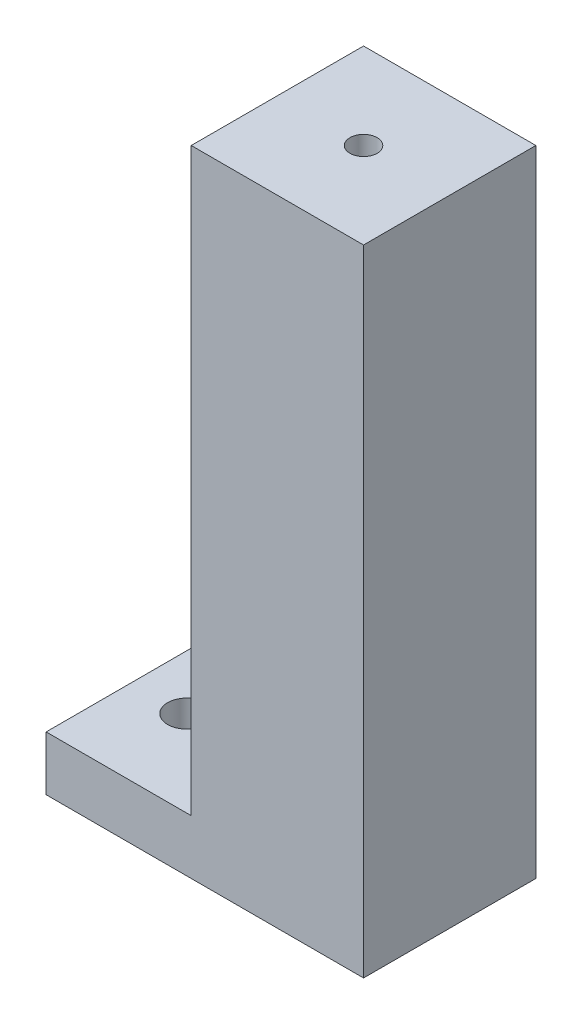
ISO-10303-21;
HEADER;
FILE_DESCRIPTION(('STEP AP214'),'2;1');
FILE_NAME('part.step','',(''),(''),'','','');
FILE_SCHEMA(('AUTOMOTIVE_DESIGN { 1 0 10303 214 1 1 1 1 }'));
ENDSEC;
DATA;
#1=APPLICATION_CONTEXT('core data for automotive mechanical design processes');
#2=APPLICATION_PROTOCOL_DEFINITION('international standard','automotive_design',2000,#1);
#3=PRODUCT_CONTEXT('',#1,'mechanical');
#4=PRODUCT('Part','Part','',(#3));
#5=PRODUCT_RELATED_PRODUCT_CATEGORY('part','',(#4));
#6=PRODUCT_DEFINITION_FORMATION('','',#4);
#7=PRODUCT_DEFINITION_CONTEXT('part definition',#1,'design');
#8=PRODUCT_DEFINITION('design','',#6,#7);
#9=PRODUCT_DEFINITION_SHAPE('','',#8);
#10=(LENGTH_UNIT() NAMED_UNIT(*) SI_UNIT(.MILLI.,.METRE.));
#11=(NAMED_UNIT(*) PLANE_ANGLE_UNIT() SI_UNIT($,.RADIAN.));
#12=(NAMED_UNIT(*) SI_UNIT($,.STERADIAN.) SOLID_ANGLE_UNIT());
#13=UNCERTAINTY_MEASURE_WITH_UNIT(LENGTH_MEASURE(1.E-05),#10,'distance_accuracy_value','');
#14=(GEOMETRIC_REPRESENTATION_CONTEXT(3) GLOBAL_UNCERTAINTY_ASSIGNED_CONTEXT((#13)) GLOBAL_UNIT_ASSIGNED_CONTEXT((#10,
#11,#12)) REPRESENTATION_CONTEXT('',''));
#15=CARTESIAN_POINT('',(0.,0.,0.));
#16=DIRECTION('',(0.,0.,1.));
#17=DIRECTION('',(1.,0.,0.));
#18=AXIS2_PLACEMENT_3D('',#15,#16,#17);
#19=CARTESIAN_POINT('',(0.,6.,0.));
#20=DIRECTION('',(0.,1.,0.));
#21=DIRECTION('',(0.,0.,1.));
#22=AXIS2_PLACEMENT_3D('',#19,#20,#21);
#23=PLANE('',#22);
#24=DIRECTION('',(0.,0.,1.));
#25=VECTOR('',#24,1.);
#26=CARTESIAN_POINT('',(-1.5,6.,9.5));
#27=LINE('',#26,#25);
#28=CARTESIAN_POINT('',(-1.5,6.,-9.5));
#29=VERTEX_POINT('',#28);
#30=CARTESIAN_POINT('',(-1.5,6.,9.5));
#31=VERTEX_POINT('',#30);
#32=EDGE_CURVE('E54',#29,#31,#27,.T.);
#33=ORIENTED_EDGE('',*,*,#32,.F.);
#34=DIRECTION('',(-1.,0.,0.));
#35=VECTOR('',#34,1.);
#36=CARTESIAN_POINT('',(-17.5,6.,-9.5));
#37=LINE('',#36,#35);
#38=CARTESIAN_POINT('',(-17.5,6.,-9.5));
#39=VERTEX_POINT('',#38);
#40=EDGE_CURVE('E91',#29,#39,#37,.T.);
#41=ORIENTED_EDGE('',*,*,#40,.T.);
#42=DIRECTION('',(0.,0.,1.));
#43=VECTOR('',#42,1.);
#44=CARTESIAN_POINT('',(-17.5,6.,-9.5));
#45=LINE('',#44,#43);
#46=CARTESIAN_POINT('',(-17.5,6.,9.5));
#47=VERTEX_POINT('',#46);
#48=EDGE_CURVE('E60',#39,#47,#45,.T.);
#49=ORIENTED_EDGE('',*,*,#48,.T.);
#50=DIRECTION('',(1.,0.,0.));
#51=VECTOR('',#50,1.);
#52=CARTESIAN_POINT('',(-17.5,6.,9.5));
#53=LINE('',#52,#51);
#54=EDGE_CURVE('E101',#47,#31,#53,.T.);
#55=ORIENTED_EDGE('',*,*,#54,.T.);
#56=EDGE_LOOP('',(#33,#41,#49,#55));
#57=FACE_BOUND('',#56,.T.);
#58=CARTESIAN_POINT('',(-11.5,6.,0.));
#59=DIRECTION('',(0.,1.,0.));
#60=DIRECTION('',(0.,0.,1.));
#61=AXIS2_PLACEMENT_3D('',#58,#59,#60);
#62=CIRCLE('',#61,2.1);
#63=CARTESIAN_POINT('',(-11.5,6.,2.1));
#64=VERTEX_POINT('',#63);
#65=EDGE_CURVE('E106',#64,#64,#62,.T.);
#66=ORIENTED_EDGE('',*,*,#65,.F.);
#67=EDGE_LOOP('',(#66));
#68=FACE_BOUND('',#67,.T.);
#69=ADVANCED_FACE('F39',(#57,#68),#23,.T.);
#70=CARTESIAN_POINT('',(0.,0.,0.));
#71=DIRECTION('',(0.,1.,0.));
#72=DIRECTION('',(0.,0.,1.));
#73=AXIS2_PLACEMENT_3D('',#70,#71,#72);
#74=PLANE('',#73);
#75=DIRECTION('',(0.,0.,-1.));
#76=VECTOR('',#75,1.);
#77=CARTESIAN_POINT('',(17.5,0.,-9.5));
#78=LINE('',#77,#76);
#79=CARTESIAN_POINT('',(17.5,0.,9.5));
#80=VERTEX_POINT('',#79);
#81=CARTESIAN_POINT('',(17.5,0.,-9.5));
#82=VERTEX_POINT('',#81);
#83=EDGE_CURVE('E97',#80,#82,#78,.T.);
#84=ORIENTED_EDGE('',*,*,#83,.F.);
#85=DIRECTION('',(1.,0.,0.));
#86=VECTOR('',#85,1.);
#87=CARTESIAN_POINT('',(-17.5,0.,9.5));
#88=LINE('',#87,#86);
#89=CARTESIAN_POINT('',(-17.5,0.,9.5));
#90=VERTEX_POINT('',#89);
#91=EDGE_CURVE('E80',#90,#80,#88,.T.);
#92=ORIENTED_EDGE('',*,*,#91,.F.);
#93=DIRECTION('',(0.,0.,1.));
#94=VECTOR('',#93,1.);
#95=CARTESIAN_POINT('',(-17.5,0.,-9.5));
#96=LINE('',#95,#94);
#97=CARTESIAN_POINT('',(-17.5,0.,-9.5));
#98=VERTEX_POINT('',#97);
#99=EDGE_CURVE('E92',#98,#90,#96,.T.);
#100=ORIENTED_EDGE('',*,*,#99,.F.);
#101=DIRECTION('',(-1.,0.,0.));
#102=VECTOR('',#101,1.);
#103=CARTESIAN_POINT('',(-17.5,0.,-9.5));
#104=LINE('',#103,#102);
#105=EDGE_CURVE('E105',#82,#98,#104,.T.);
#106=ORIENTED_EDGE('',*,*,#105,.F.);
#107=EDGE_LOOP('',(#84,#92,#100,#106));
#108=FACE_BOUND('',#107,.T.);
#109=CARTESIAN_POINT('',(-11.5,0.,0.));
#110=DIRECTION('',(0.,1.,0.));
#111=DIRECTION('',(0.,0.,1.));
#112=AXIS2_PLACEMENT_3D('',#109,#110,#111);
#113=CIRCLE('',#112,2.1);
#114=CARTESIAN_POINT('',(-11.5,0.,2.1));
#115=VERTEX_POINT('',#114);
#116=EDGE_CURVE('E110',#115,#115,#113,.T.);
#117=ORIENTED_EDGE('',*,*,#116,.T.);
#118=EDGE_LOOP('',(#117));
#119=FACE_BOUND('',#118,.T.);
#120=ADVANCED_FACE('F103',(#108,#119),#74,.F.);
#121=CARTESIAN_POINT('',(17.5,6.,-9.5));
#122=DIRECTION('',(-1.,0.,0.));
#123=DIRECTION('',(0.,0.,1.));
#124=AXIS2_PLACEMENT_3D('',#121,#122,#123);
#125=PLANE('',#124);
#126=ORIENTED_EDGE('',*,*,#83,.T.);
#127=DIRECTION('',(0.,-1.,0.));
#128=VECTOR('',#127,1.);
#129=CARTESIAN_POINT('',(17.5,6.,-9.5));
#130=LINE('',#129,#128);
#131=CARTESIAN_POINT('',(17.5,70.0000000000111,-9.5));
#132=VERTEX_POINT('',#131);
#133=EDGE_CURVE('E11',#132,#82,#130,.T.);
#134=ORIENTED_EDGE('',*,*,#133,.F.);
#135=DIRECTION('',(0.,0.,-1.));
#136=VECTOR('',#135,1.);
#137=CARTESIAN_POINT('',(17.5,70.0000000000129,9.50000000000019));
#138=LINE('',#137,#136);
#139=CARTESIAN_POINT('',(17.5,70.0000000000129,9.5));
#140=VERTEX_POINT('',#139);
#141=EDGE_CURVE('E99',#140,#132,#138,.T.);
#142=ORIENTED_EDGE('',*,*,#141,.F.);
#143=DIRECTION('',(0.,-1.,0.));
#144=VECTOR('',#143,1.);
#145=CARTESIAN_POINT('',(17.5,6.,9.5));
#146=LINE('',#145,#144);
#147=EDGE_CURVE('E84',#140,#80,#146,.T.);
#148=ORIENTED_EDGE('',*,*,#147,.T.);
#149=EDGE_LOOP('',(#126,#134,#142,#148));
#150=FACE_BOUND('',#149,.T.);
#151=ADVANCED_FACE('F41',(#150),#125,.F.);
#152=CARTESIAN_POINT('',(-17.5,6.,-9.5));
#153=DIRECTION('',(0.,0.,1.));
#154=DIRECTION('',(1.,0.,0.));
#155=AXIS2_PLACEMENT_3D('',#152,#153,#154);
#156=PLANE('',#155);
#157=ORIENTED_EDGE('',*,*,#105,.T.);
#158=DIRECTION('',(0.,-1.,0.));
#159=VECTOR('',#158,1.);
#160=CARTESIAN_POINT('',(-17.5,6.,-9.5));
#161=LINE('',#160,#159);
#162=EDGE_CURVE('E47',#39,#98,#161,.T.);
#163=ORIENTED_EDGE('',*,*,#162,.F.);
#164=ORIENTED_EDGE('',*,*,#40,.F.);
#165=DIRECTION('',(0.,-1.,0.));
#166=VECTOR('',#165,1.);
#167=CARTESIAN_POINT('',(-1.5,96.8700576851,-9.5));
#168=LINE('',#167,#166);
#169=CARTESIAN_POINT('',(-1.5,70.0000000000096,-9.5));
#170=VERTEX_POINT('',#169);
#171=EDGE_CURVE('E156',#170,#29,#168,.T.);
#172=ORIENTED_EDGE('',*,*,#171,.F.);
#173=DIRECTION('',(-1.,-1.68967270730569E-13,0.));
#174=VECTOR('',#173,1.);
#175=CARTESIAN_POINT('',(-1.49999999999546,70.0000000000095,-9.5));
#176=LINE('',#175,#174);
#177=EDGE_CURVE('E127',#132,#170,#176,.T.);
#178=ORIENTED_EDGE('',*,*,#177,.F.);
#179=ORIENTED_EDGE('',*,*,#133,.T.);
#180=EDGE_LOOP('',(#157,#163,#164,#172,#178,#179));
#181=FACE_BOUND('',#180,.T.);
#182=ADVANCED_FACE('F121',(#181),#156,.F.);
#183=CARTESIAN_POINT('',(-17.5,6.,-9.5));
#184=DIRECTION('',(1.,0.,0.));
#185=DIRECTION('',(0.,0.,-1.));
#186=AXIS2_PLACEMENT_3D('',#183,#184,#185);
#187=PLANE('',#186);
#188=ORIENTED_EDGE('',*,*,#99,.T.);
#189=DIRECTION('',(0.,-1.,0.));
#190=VECTOR('',#189,1.);
#191=CARTESIAN_POINT('',(-17.5,6.,9.5));
#192=LINE('',#191,#190);
#193=EDGE_CURVE('E87',#47,#90,#192,.T.);
#194=ORIENTED_EDGE('',*,*,#193,.F.);
#195=ORIENTED_EDGE('',*,*,#48,.F.);
#196=ORIENTED_EDGE('',*,*,#162,.T.);
#197=EDGE_LOOP('',(#188,#194,#195,#196));
#198=FACE_BOUND('',#197,.T.);
#199=ADVANCED_FACE('F119',(#198),#187,.F.);
#200=CARTESIAN_POINT('',(-17.5,6.,9.5));
#201=DIRECTION('',(0.,0.,-1.));
#202=DIRECTION('',(-1.,0.,0.));
#203=AXIS2_PLACEMENT_3D('',#200,#201,#202);
#204=PLANE('',#203);
#205=ORIENTED_EDGE('',*,*,#91,.T.);
#206=ORIENTED_EDGE('',*,*,#147,.F.);
#207=DIRECTION('',(1.,1.68967270730569E-13,0.));
#208=VECTOR('',#207,1.);
#209=CARTESIAN_POINT('',(-1.49999999999546,70.0000000000097,9.5));
#210=LINE('',#209,#208);
#211=CARTESIAN_POINT('',(-1.5,70.0000000000113,9.5));
#212=VERTEX_POINT('',#211);
#213=EDGE_CURVE('E143',#212,#140,#210,.T.);
#214=ORIENTED_EDGE('',*,*,#213,.F.);
#215=DIRECTION('',(0.,-1.,0.));
#216=VECTOR('',#215,1.);
#217=CARTESIAN_POINT('',(-1.5,96.8700576851,9.5));
#218=LINE('',#217,#216);
#219=EDGE_CURVE('E139',#212,#31,#218,.T.);
#220=ORIENTED_EDGE('',*,*,#219,.T.);
#221=ORIENTED_EDGE('',*,*,#54,.F.);
#222=ORIENTED_EDGE('',*,*,#193,.T.);
#223=EDGE_LOOP('',(#205,#206,#214,#220,#221,#222));
#224=FACE_BOUND('',#223,.T.);
#225=ADVANCED_FACE('F82',(#224),#204,.F.);
#226=CARTESIAN_POINT('',(-11.5,6.,0.));
#227=DIRECTION('',(0.,-1.,0.));
#228=DIRECTION('',(0.,0.,-1.));
#229=AXIS2_PLACEMENT_3D('',#226,#227,#228);
#230=CYLINDRICAL_SURFACE('',#229,2.1);
#231=ORIENTED_EDGE('',*,*,#65,.T.);
#232=EDGE_LOOP('',(#231));
#233=FACE_BOUND('',#232,.T.);
#234=ORIENTED_EDGE('',*,*,#116,.F.);
#235=EDGE_LOOP('',(#234));
#236=FACE_BOUND('',#235,.T.);
#237=ADVANCED_FACE('F164',(#233,#236),#230,.F.);
#238=CARTESIAN_POINT('',(-1.5,96.8700576851,9.5));
#239=DIRECTION('',(1.,0.,0.));
#240=DIRECTION('',(0.,0.,-1.));
#241=AXIS2_PLACEMENT_3D('',#238,#239,#240);
#242=PLANE('',#241);
#243=DIRECTION('',(0.,0.,1.));
#244=VECTOR('',#243,1.);
#245=CARTESIAN_POINT('',(-1.5,70.0000000000097,9.50000000000019));
#246=LINE('',#245,#244);
#247=EDGE_CURVE('E142',#170,#212,#246,.T.);
#248=ORIENTED_EDGE('',*,*,#247,.F.);
#249=ORIENTED_EDGE('',*,*,#171,.T.);
#250=ORIENTED_EDGE('',*,*,#32,.T.);
#251=ORIENTED_EDGE('',*,*,#219,.F.);
#252=EDGE_LOOP('',(#248,#249,#250,#251));
#253=FACE_BOUND('',#252,.T.);
#254=ADVANCED_FACE('F140',(#253),#242,.F.);
#255=CARTESIAN_POINT('',(-177.00000000005,69.9999999999813,184.999999999998));
#256=DIRECTION('',(-1.68967270730569E-13,1.,0.));
#257=DIRECTION('',(1.,1.68967270730569E-13,0.));
#258=AXIS2_PLACEMENT_3D('',#255,#256,#257);
#259=PLANE('',#258);
#260=CARTESIAN_POINT('',(8.,70.0000000000099,0.));
#261=DIRECTION('',(0.,1.,0.));
#262=DIRECTION('',(0.,0.,1.));
#263=AXIS2_PLACEMENT_3D('',#260,#261,#262);
#264=CIRCLE('',#263,1.49999999999841);
#265=CARTESIAN_POINT('',(8.,70.0000000000099,1.4999999999984));
#266=VERTEX_POINT('',#265);
#267=EDGE_CURVE('E289',#266,#266,#264,.T.);
#268=ORIENTED_EDGE('',*,*,#267,.F.);
#269=EDGE_LOOP('',(#268));
#270=FACE_BOUND('',#269,.T.);
#271=ORIENTED_EDGE('',*,*,#213,.T.);
#272=ORIENTED_EDGE('',*,*,#141,.T.);
#273=ORIENTED_EDGE('',*,*,#177,.T.);
#274=ORIENTED_EDGE('',*,*,#247,.T.);
#275=EDGE_LOOP('',(#271,#272,#273,#274));
#276=FACE_BOUND('',#275,.T.);
#277=ADVANCED_FACE('F147',(#270,#276),#259,.T.);
#278=CARTESIAN_POINT('',(8.,60.0000000000099,0.));
#279=DIRECTION('',(0.,1.,0.));
#280=DIRECTION('',(0.,0.,1.));
#281=AXIS2_PLACEMENT_3D('',#278,#279,#280);
#282=CYLINDRICAL_SURFACE('',#281,1.49999999999841);
#283=CARTESIAN_POINT('',(8.,60.0000000000099,0.));
#284=DIRECTION('',(0.,1.,0.));
#285=DIRECTION('',(0.,0.,1.));
#286=AXIS2_PLACEMENT_3D('',#283,#284,#285);
#287=CIRCLE('',#286,1.49999999999841);
#288=CARTESIAN_POINT('',(8.,60.0000000000099,1.4999999999984));
#289=VERTEX_POINT('',#288);
#290=EDGE_CURVE('E157',#289,#289,#287,.T.);
#291=ORIENTED_EDGE('',*,*,#290,.F.);
#292=EDGE_LOOP('',(#291));
#293=FACE_BOUND('',#292,.T.);
#294=ORIENTED_EDGE('',*,*,#267,.T.);
#295=EDGE_LOOP('',(#294));
#296=FACE_BOUND('',#295,.T.);
#297=ADVANCED_FACE('F208',(#293,#296),#282,.F.);
#298=CARTESIAN_POINT('',(8.,60.0000000000099,0.));
#299=DIRECTION('',(0.,1.,0.));
#300=DIRECTION('',(0.,0.,1.));
#301=AXIS2_PLACEMENT_3D('',#298,#299,#300);
#302=PLANE('',#301);
#303=ORIENTED_EDGE('',*,*,#290,.T.);
#304=EDGE_LOOP('',(#303));
#305=FACE_BOUND('',#304,.T.);
#306=ADVANCED_FACE('F216',(#305),#302,.T.);
#307=CLOSED_SHELL('',(#69,#120,#151,#182,#199,#225,#237,#254,#277,#297,#306));
#308=MANIFOLD_SOLID_BREP('B2',#307);
#309=ADVANCED_BREP_SHAPE_REPRESENTATION('',(#18,#308),#14);
#310=SHAPE_DEFINITION_REPRESENTATION(#9,#309);
ENDSEC;
END-ISO-10303-21;
